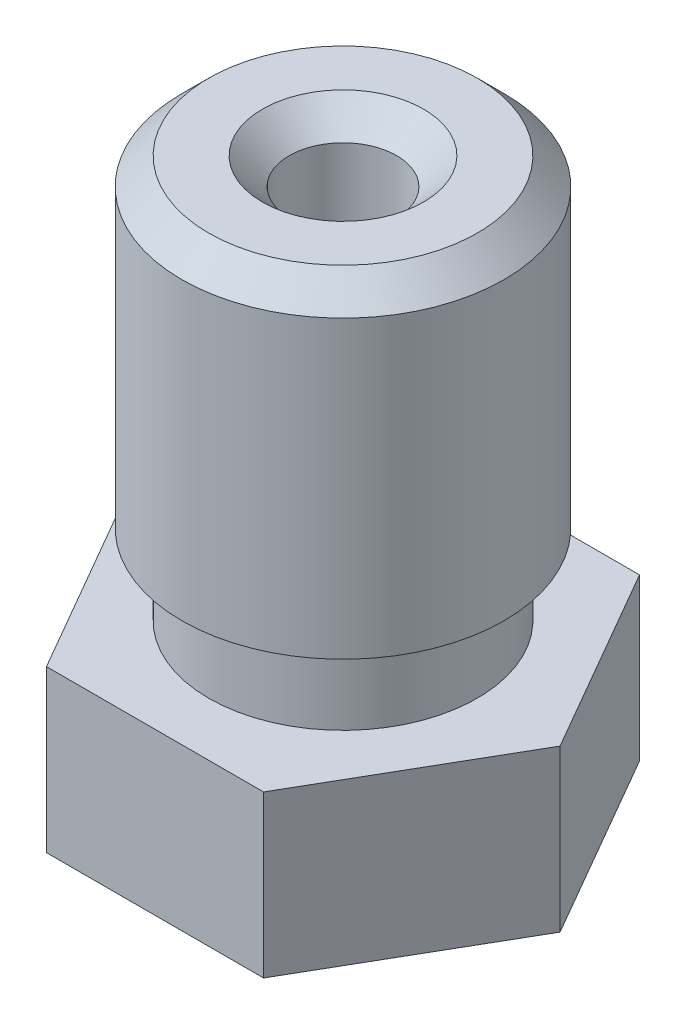
ISO-10303-21;
HEADER;
FILE_DESCRIPTION(('STEP AP214'),'2;1');
FILE_NAME('part.step','',(''),(''),'','','');
FILE_SCHEMA(('AUTOMOTIVE_DESIGN { 1 0 10303 214 1 1 1 1 }'));
ENDSEC;
DATA;
#1=APPLICATION_CONTEXT('core data for automotive mechanical design processes');
#2=APPLICATION_PROTOCOL_DEFINITION('international standard','automotive_design',2000,#1);
#3=PRODUCT_CONTEXT('',#1,'mechanical');
#4=PRODUCT('Part','Part','',(#3));
#5=PRODUCT_RELATED_PRODUCT_CATEGORY('part','',(#4));
#6=PRODUCT_DEFINITION_FORMATION('','',#4);
#7=PRODUCT_DEFINITION_CONTEXT('part definition',#1,'design');
#8=PRODUCT_DEFINITION('design','',#6,#7);
#9=PRODUCT_DEFINITION_SHAPE('','',#8);
#10=(LENGTH_UNIT() NAMED_UNIT(*) SI_UNIT(.MILLI.,.METRE.));
#11=(NAMED_UNIT(*) PLANE_ANGLE_UNIT() SI_UNIT($,.RADIAN.));
#12=(NAMED_UNIT(*) SI_UNIT($,.STERADIAN.) SOLID_ANGLE_UNIT());
#13=UNCERTAINTY_MEASURE_WITH_UNIT(LENGTH_MEASURE(1.E-05),#10,'distance_accuracy_value','');
#14=(GEOMETRIC_REPRESENTATION_CONTEXT(3) GLOBAL_UNCERTAINTY_ASSIGNED_CONTEXT((#13)) GLOBAL_UNIT_ASSIGNED_CONTEXT((#10,
#11,#12)) REPRESENTATION_CONTEXT('',''));
#15=CARTESIAN_POINT('',(0.,0.,0.));
#16=DIRECTION('',(0.,0.,1.));
#17=DIRECTION('',(1.,0.,0.));
#18=AXIS2_PLACEMENT_3D('',#15,#16,#17);
#19=CARTESIAN_POINT('',(2.02072594216369,3.,3.5));
#20=DIRECTION('',(0.,0.,1.));
#21=DIRECTION('',(1.,0.,0.));
#22=AXIS2_PLACEMENT_3D('',#19,#20,#21);
#23=PLANE('',#22);
#24=DIRECTION('',(-1.,0.,0.));
#25=VECTOR('',#24,1.);
#26=CARTESIAN_POINT('',(2.02072594216369,0.,3.5));
#27=LINE('',#26,#25);
#28=CARTESIAN_POINT('',(2.02072594216369,0.,3.5));
#29=VERTEX_POINT('',#28);
#30=CARTESIAN_POINT('',(-2.02072594216369,0.,3.5));
#31=VERTEX_POINT('',#30);
#32=EDGE_CURVE('E120',#29,#31,#27,.T.);
#33=ORIENTED_EDGE('',*,*,#32,.F.);
#34=DIRECTION('',(0.,-1.,0.));
#35=VECTOR('',#34,1.);
#36=CARTESIAN_POINT('',(2.02072594216369,3.,3.5));
#37=LINE('',#36,#35);
#38=CARTESIAN_POINT('',(2.02072594216369,3.,3.5));
#39=VERTEX_POINT('',#38);
#40=EDGE_CURVE('E49',#39,#29,#37,.T.);
#41=ORIENTED_EDGE('',*,*,#40,.F.);
#42=DIRECTION('',(-1.,0.,0.));
#43=VECTOR('',#42,1.);
#44=CARTESIAN_POINT('',(2.02072594216369,3.,3.5));
#45=LINE('',#44,#43);
#46=CARTESIAN_POINT('',(-2.02072594216369,3.,3.5));
#47=VERTEX_POINT('',#46);
#48=EDGE_CURVE('E136',#39,#47,#45,.T.);
#49=ORIENTED_EDGE('',*,*,#48,.T.);
#50=DIRECTION('',(0.,-1.,0.));
#51=VECTOR('',#50,1.);
#52=CARTESIAN_POINT('',(-2.02072594216369,3.,3.5));
#53=LINE('',#52,#51);
#54=EDGE_CURVE('E84',#47,#31,#53,.T.);
#55=ORIENTED_EDGE('',*,*,#54,.T.);
#56=EDGE_LOOP('',(#33,#41,#49,#55));
#57=FACE_BOUND('',#56,.T.);
#58=ADVANCED_FACE('F32',(#57),#23,.T.);
#59=CARTESIAN_POINT('',(4.04145188432738,3.,0.));
#60=DIRECTION('',(0.866025403784439,0.,0.5));
#61=DIRECTION('',(0.5,0.,-0.866025403784439));
#62=AXIS2_PLACEMENT_3D('',#59,#60,#61);
#63=PLANE('',#62);
#64=DIRECTION('',(-0.5,0.,0.866025403784439));
#65=VECTOR('',#64,1.);
#66=CARTESIAN_POINT('',(4.04145188432738,0.,0.));
#67=LINE('',#66,#65);
#68=CARTESIAN_POINT('',(4.04145188432738,0.,0.));
#69=VERTEX_POINT('',#68);
#70=EDGE_CURVE('E133',#69,#29,#67,.T.);
#71=ORIENTED_EDGE('',*,*,#70,.F.);
#72=DIRECTION('',(0.,-1.,0.));
#73=VECTOR('',#72,1.);
#74=CARTESIAN_POINT('',(4.04145188432738,3.,0.));
#75=LINE('',#74,#73);
#76=CARTESIAN_POINT('',(4.04145188432738,3.,0.));
#77=VERTEX_POINT('',#76);
#78=EDGE_CURVE('E72',#77,#69,#75,.T.);
#79=ORIENTED_EDGE('',*,*,#78,.F.);
#80=DIRECTION('',(-0.5,0.,0.866025403784439));
#81=VECTOR('',#80,1.);
#82=CARTESIAN_POINT('',(4.04145188432738,3.,0.));
#83=LINE('',#82,#81);
#84=EDGE_CURVE('E110',#77,#39,#83,.T.);
#85=ORIENTED_EDGE('',*,*,#84,.T.);
#86=ORIENTED_EDGE('',*,*,#40,.T.);
#87=EDGE_LOOP('',(#71,#79,#85,#86));
#88=FACE_BOUND('',#87,.T.);
#89=ADVANCED_FACE('F209',(#88),#63,.T.);
#90=CARTESIAN_POINT('',(2.02072594216369,3.,-3.5));
#91=DIRECTION('',(0.866025403784438,0.,-0.500000000000001));
#92=DIRECTION('',(-0.500000000000001,0.,-0.866025403784438));
#93=AXIS2_PLACEMENT_3D('',#90,#91,#92);
#94=PLANE('',#93);
#95=DIRECTION('',(0.500000000000001,0.,0.866025403784438));
#96=VECTOR('',#95,1.);
#97=CARTESIAN_POINT('',(2.02072594216369,0.,-3.5));
#98=LINE('',#97,#96);
#99=CARTESIAN_POINT('',(2.02072594216369,0.,-3.5));
#100=VERTEX_POINT('',#99);
#101=EDGE_CURVE('E97',#100,#69,#98,.T.);
#102=ORIENTED_EDGE('',*,*,#101,.F.);
#103=DIRECTION('',(0.,-1.,0.));
#104=VECTOR('',#103,1.);
#105=CARTESIAN_POINT('',(2.02072594216369,3.,-3.5));
#106=LINE('',#105,#104);
#107=CARTESIAN_POINT('',(2.02072594216369,3.,-3.5));
#108=VERTEX_POINT('',#107);
#109=EDGE_CURVE('E92',#108,#100,#106,.T.);
#110=ORIENTED_EDGE('',*,*,#109,.F.);
#111=DIRECTION('',(0.500000000000001,0.,0.866025403784438));
#112=VECTOR('',#111,1.);
#113=CARTESIAN_POINT('',(2.02072594216369,3.,-3.5));
#114=LINE('',#113,#112);
#115=EDGE_CURVE('E95',#108,#77,#114,.T.);
#116=ORIENTED_EDGE('',*,*,#115,.T.);
#117=ORIENTED_EDGE('',*,*,#78,.T.);
#118=EDGE_LOOP('',(#102,#110,#116,#117));
#119=FACE_BOUND('',#118,.T.);
#120=ADVANCED_FACE('F94',(#119),#94,.T.);
#121=CARTESIAN_POINT('',(-2.02072594216369,3.,-3.5));
#122=DIRECTION('',(0.,0.,-1.));
#123=DIRECTION('',(-1.,0.,0.));
#124=AXIS2_PLACEMENT_3D('',#121,#122,#123);
#125=PLANE('',#124);
#126=DIRECTION('',(1.,0.,0.));
#127=VECTOR('',#126,1.);
#128=CARTESIAN_POINT('',(-2.02072594216369,0.,-3.5));
#129=LINE('',#128,#127);
#130=CARTESIAN_POINT('',(-2.02072594216369,0.,-3.5));
#131=VERTEX_POINT('',#130);
#132=EDGE_CURVE('E130',#131,#100,#129,.T.);
#133=ORIENTED_EDGE('',*,*,#132,.F.);
#134=DIRECTION('',(0.,-1.,0.));
#135=VECTOR('',#134,1.);
#136=CARTESIAN_POINT('',(-2.02072594216369,3.,-3.5));
#137=LINE('',#136,#135);
#138=CARTESIAN_POINT('',(-2.02072594216369,3.,-3.5));
#139=VERTEX_POINT('',#138);
#140=EDGE_CURVE('E102',#139,#131,#137,.T.);
#141=ORIENTED_EDGE('',*,*,#140,.F.);
#142=DIRECTION('',(1.,0.,0.));
#143=VECTOR('',#142,1.);
#144=CARTESIAN_POINT('',(-2.02072594216369,3.,-3.5));
#145=LINE('',#144,#143);
#146=EDGE_CURVE('E108',#139,#108,#145,.T.);
#147=ORIENTED_EDGE('',*,*,#146,.T.);
#148=ORIENTED_EDGE('',*,*,#109,.T.);
#149=EDGE_LOOP('',(#133,#141,#147,#148));
#150=FACE_BOUND('',#149,.T.);
#151=ADVANCED_FACE('F112',(#150),#125,.T.);
#152=CARTESIAN_POINT('',(-4.04145188432738,3.,0.));
#153=DIRECTION('',(-0.866025403784439,0.,-0.5));
#154=DIRECTION('',(-0.5,0.,0.866025403784439));
#155=AXIS2_PLACEMENT_3D('',#152,#153,#154);
#156=PLANE('',#155);
#157=DIRECTION('',(0.5,0.,-0.866025403784439));
#158=VECTOR('',#157,1.);
#159=CARTESIAN_POINT('',(-4.04145188432738,0.,0.));
#160=LINE('',#159,#158);
#161=CARTESIAN_POINT('',(-4.04145188432738,0.,0.));
#162=VERTEX_POINT('',#161);
#163=EDGE_CURVE('E127',#162,#131,#160,.T.);
#164=ORIENTED_EDGE('',*,*,#163,.F.);
#165=DIRECTION('',(0.,-1.,0.));
#166=VECTOR('',#165,1.);
#167=CARTESIAN_POINT('',(-4.04145188432738,3.,0.));
#168=LINE('',#167,#166);
#169=CARTESIAN_POINT('',(-4.04145188432738,3.,0.));
#170=VERTEX_POINT('',#169);
#171=EDGE_CURVE('E141',#170,#162,#168,.T.);
#172=ORIENTED_EDGE('',*,*,#171,.F.);
#173=DIRECTION('',(0.5,0.,-0.866025403784439));
#174=VECTOR('',#173,1.);
#175=CARTESIAN_POINT('',(-4.04145188432738,3.,0.));
#176=LINE('',#175,#174);
#177=EDGE_CURVE('E113',#170,#139,#176,.T.);
#178=ORIENTED_EDGE('',*,*,#177,.T.);
#179=ORIENTED_EDGE('',*,*,#140,.T.);
#180=EDGE_LOOP('',(#164,#172,#178,#179));
#181=FACE_BOUND('',#180,.T.);
#182=ADVANCED_FACE('F223',(#181),#156,.T.);
#183=CARTESIAN_POINT('',(-2.02072594216369,3.,3.5));
#184=DIRECTION('',(-0.866025403784439,0.,0.5));
#185=DIRECTION('',(0.5,0.,0.866025403784439));
#186=AXIS2_PLACEMENT_3D('',#183,#184,#185);
#187=PLANE('',#186);
#188=DIRECTION('',(-0.5,0.,-0.866025403784439));
#189=VECTOR('',#188,1.);
#190=CARTESIAN_POINT('',(-2.02072594216369,0.,3.5));
#191=LINE('',#190,#189);
#192=EDGE_CURVE('E123',#31,#162,#191,.T.);
#193=ORIENTED_EDGE('',*,*,#192,.F.);
#194=ORIENTED_EDGE('',*,*,#54,.F.);
#195=DIRECTION('',(-0.5,0.,-0.866025403784439));
#196=VECTOR('',#195,1.);
#197=CARTESIAN_POINT('',(-2.02072594216369,3.,3.5));
#198=LINE('',#197,#196);
#199=EDGE_CURVE('E115',#47,#170,#198,.T.);
#200=ORIENTED_EDGE('',*,*,#199,.T.);
#201=ORIENTED_EDGE('',*,*,#171,.T.);
#202=EDGE_LOOP('',(#193,#194,#200,#201));
#203=FACE_BOUND('',#202,.T.);
#204=ADVANCED_FACE('F205',(#203),#187,.T.);
#205=CARTESIAN_POINT('',(0.,3.,0.));
#206=DIRECTION('',(0.,-1.,0.));
#207=DIRECTION('',(0.,0.,-1.));
#208=AXIS2_PLACEMENT_3D('',#205,#206,#207);
#209=PLANE('',#208);
#210=CARTESIAN_POINT('',(0.,3.,0.));
#211=DIRECTION('',(0.,1.,0.));
#212=DIRECTION('',(0.,0.,1.));
#213=AXIS2_PLACEMENT_3D('',#210,#211,#212);
#214=CIRCLE('',#213,2.5);
#215=CARTESIAN_POINT('',(0.,3.,2.5));
#216=VERTEX_POINT('',#215);
#217=EDGE_CURVE('E124',#216,#216,#214,.T.);
#218=ORIENTED_EDGE('',*,*,#217,.F.);
#219=EDGE_LOOP('',(#218));
#220=FACE_BOUND('',#219,.T.);
#221=ORIENTED_EDGE('',*,*,#48,.F.);
#222=ORIENTED_EDGE('',*,*,#84,.F.);
#223=ORIENTED_EDGE('',*,*,#115,.F.);
#224=ORIENTED_EDGE('',*,*,#146,.F.);
#225=ORIENTED_EDGE('',*,*,#177,.F.);
#226=ORIENTED_EDGE('',*,*,#199,.F.);
#227=EDGE_LOOP('',(#221,#222,#223,#224,#225,#226));
#228=FACE_BOUND('',#227,.T.);
#229=ADVANCED_FACE('F106',(#220,#228),#209,.F.);
#230=CARTESIAN_POINT('',(0.,0.,0.));
#231=DIRECTION('',(0.,-1.,0.));
#232=DIRECTION('',(0.,0.,-1.));
#233=AXIS2_PLACEMENT_3D('',#230,#231,#232);
#234=PLANE('',#233);
#235=CARTESIAN_POINT('',(0.,0.,0.));
#236=DIRECTION('',(0.,-1.,0.));
#237=DIRECTION('',(0.,0.,-1.));
#238=AXIS2_PLACEMENT_3D('',#235,#236,#237);
#239=CIRCLE('',#238,2.50000000004502);
#240=CARTESIAN_POINT('',(-2.50000000004502,0.,0.));
#241=VERTEX_POINT('',#240);
#242=EDGE_CURVE('E138',#241,#241,#239,.T.);
#243=ORIENTED_EDGE('',*,*,#242,.F.);
#244=EDGE_LOOP('',(#243));
#245=FACE_BOUND('',#244,.T.);
#246=ORIENTED_EDGE('',*,*,#32,.T.);
#247=ORIENTED_EDGE('',*,*,#192,.T.);
#248=ORIENTED_EDGE('',*,*,#163,.T.);
#249=ORIENTED_EDGE('',*,*,#132,.T.);
#250=ORIENTED_EDGE('',*,*,#101,.T.);
#251=ORIENTED_EDGE('',*,*,#70,.T.);
#252=EDGE_LOOP('',(#246,#247,#248,#249,#250,#251));
#253=FACE_BOUND('',#252,.T.);
#254=ADVANCED_FACE('F208',(#245,#253),#234,.T.);
#255=CARTESIAN_POINT('',(0.,3.,0.));
#256=DIRECTION('',(0.,1.,0.));
#257=DIRECTION('',(0.,0.,1.));
#258=AXIS2_PLACEMENT_3D('',#255,#256,#257);
#259=CYLINDRICAL_SURFACE('',#258,2.5);
#260=ORIENTED_EDGE('',*,*,#217,.T.);
#261=EDGE_LOOP('',(#260));
#262=FACE_BOUND('',#261,.T.);
#263=CARTESIAN_POINT('',(0.,4.5,0.));
#264=DIRECTION('',(0.,1.,0.));
#265=DIRECTION('',(0.,0.,1.));
#266=AXIS2_PLACEMENT_3D('',#263,#264,#265);
#267=CIRCLE('',#266,2.5);
#268=CARTESIAN_POINT('',(0.,4.5,2.5));
#269=VERTEX_POINT('',#268);
#270=EDGE_CURVE('E197',#269,#269,#267,.T.);
#271=ORIENTED_EDGE('',*,*,#270,.F.);
#272=EDGE_LOOP('',(#271));
#273=FACE_BOUND('',#272,.T.);
#274=ADVANCED_FACE('F166',(#262,#273),#259,.T.);
#275=CARTESIAN_POINT('',(0.,10.5,0.));
#276=DIRECTION('',(0.,1.,0.));
#277=DIRECTION('',(0.,0.,1.));
#278=AXIS2_PLACEMENT_3D('',#275,#276,#277);
#279=PLANE('',#278);
#280=CARTESIAN_POINT('',(0.,10.5,0.));
#281=DIRECTION('',(0.,1.,0.));
#282=DIRECTION('',(0.,0.,1.));
#283=AXIS2_PLACEMENT_3D('',#280,#281,#282);
#284=CIRCLE('',#283,2.4999999999834);
#285=CARTESIAN_POINT('',(0.,10.5,2.4999999999834));
#286=VERTEX_POINT('',#285);
#287=EDGE_CURVE('E149',#286,#286,#284,.T.);
#288=ORIENTED_EDGE('',*,*,#287,.T.);
#289=EDGE_LOOP('',(#288));
#290=FACE_BOUND('',#289,.T.);
#291=CARTESIAN_POINT('',(-1.10963134903613E-11,10.5,0.));
#292=DIRECTION('',(0.,1.,0.));
#293=DIRECTION('',(0.,0.,1.));
#294=AXIS2_PLACEMENT_3D('',#291,#292,#293);
#295=CIRCLE('',#294,1.5000000000277);
#296=CARTESIAN_POINT('',(-1.10963134903613E-11,10.5,1.5000000000277));
#297=VERTEX_POINT('',#296);
#298=EDGE_CURVE('E146',#297,#297,#295,.F.);
#299=ORIENTED_EDGE('',*,*,#298,.T.);
#300=EDGE_LOOP('',(#299));
#301=FACE_BOUND('',#300,.T.);
#302=ADVANCED_FACE('F163',(#290,#301),#279,.T.);
#303=CARTESIAN_POINT('',(0.,3.,0.));
#304=DIRECTION('',(0.,1.,0.));
#305=DIRECTION('',(0.,0.,1.));
#306=AXIS2_PLACEMENT_3D('',#303,#304,#305);
#307=CYLINDRICAL_SURFACE('',#306,3.);
#308=CARTESIAN_POINT('',(0.,9.9999999999834,0.));
#309=DIRECTION('',(0.,1.,0.));
#310=DIRECTION('',(0.,0.,1.));
#311=AXIS2_PLACEMENT_3D('',#308,#309,#310);
#312=CIRCLE('',#311,3.);
#313=CARTESIAN_POINT('',(0.,9.9999999999834,3.));
#314=VERTEX_POINT('',#313);
#315=EDGE_CURVE('E41',#314,#314,#312,.F.);
#316=ORIENTED_EDGE('',*,*,#315,.T.);
#317=EDGE_LOOP('',(#316));
#318=FACE_BOUND('',#317,.T.);
#319=CARTESIAN_POINT('',(0.,4.5,0.));
#320=DIRECTION('',(0.,1.,0.));
#321=DIRECTION('',(0.,0.,1.));
#322=AXIS2_PLACEMENT_3D('',#319,#320,#321);
#323=CIRCLE('',#322,3.);
#324=CARTESIAN_POINT('',(0.,4.5,3.));
#325=VERTEX_POINT('',#324);
#326=EDGE_CURVE('E200',#325,#325,#323,.T.);
#327=ORIENTED_EDGE('',*,*,#326,.T.);
#328=EDGE_LOOP('',(#327));
#329=FACE_BOUND('',#328,.T.);
#330=ADVANCED_FACE('F154',(#318,#329),#307,.T.);
#331=CARTESIAN_POINT('',(3.,4.5,0.));
#332=DIRECTION('',(0.,-1.,0.));
#333=DIRECTION('',(0.,0.,-1.));
#334=AXIS2_PLACEMENT_3D('',#331,#332,#333);
#335=PLANE('',#334);
#336=ORIENTED_EDGE('',*,*,#270,.T.);
#337=EDGE_LOOP('',(#336));
#338=FACE_BOUND('',#337,.T.);
#339=ORIENTED_EDGE('',*,*,#326,.F.);
#340=EDGE_LOOP('',(#339));
#341=FACE_BOUND('',#340,.T.);
#342=ADVANCED_FACE('F243',(#338,#341),#335,.T.);
#343=CARTESIAN_POINT('',(0.,-2.,0.));
#344=DIRECTION('',(0.,1.,0.));
#345=DIRECTION('',(-1.,0.,0.));
#346=AXIS2_PLACEMENT_3D('',#343,#344,#345);
#347=CONICAL_SURFACE('',#346,0.50000000004502,0.785398163397449);
#348=CARTESIAN_POINT('',(0.,-2.,0.));
#349=DIRECTION('',(0.,-1.,0.));
#350=DIRECTION('',(1.,0.,0.));
#351=AXIS2_PLACEMENT_3D('',#348,#349,#350);
#352=CIRCLE('',#351,0.50000000004502);
#353=CARTESIAN_POINT('',(-0.50000000004502,-2.,0.));
#354=VERTEX_POINT('',#353);
#355=EDGE_CURVE('E188',#354,#354,#352,.T.);
#356=CARTESIAN_POINT('',(-2.50000000004502,0.,0.));
#357=CARTESIAN_POINT('',(-2.47916666671169,-0.0208333333333329,0.));
#358=CARTESIAN_POINT('',(-2.45833333337836,-0.0416666666666663,0.));
#359=CARTESIAN_POINT('',(-2.41666666671169,-0.083333333333333,0.));
#360=CARTESIAN_POINT('',(-2.39583333337836,-0.104166666666666,0.));
#361=CARTESIAN_POINT('',(-2.35416666671169,-0.145833333333333,0.));
#362=CARTESIAN_POINT('',(-2.33333333337836,-0.166666666666666,0.));
#363=CARTESIAN_POINT('',(-2.29166666671169,-0.208333333333333,0.));
#364=CARTESIAN_POINT('',(-2.27083333337836,-0.229166666666666,0.));
#365=CARTESIAN_POINT('',(-2.22916666671169,-0.270833333333333,0.));
#366=CARTESIAN_POINT('',(-2.20833333337836,-0.291666666666666,0.));
#367=CARTESIAN_POINT('',(-2.16666666671169,-0.333333333333333,0.));
#368=CARTESIAN_POINT('',(-2.14583333337836,-0.354166666666667,0.));
#369=CARTESIAN_POINT('',(-2.10416666671169,-0.395833333333333,0.));
#370=CARTESIAN_POINT('',(-2.08333333337836,-0.416666666666667,0.));
#371=CARTESIAN_POINT('',(-2.04166666671169,-0.458333333333334,0.));
#372=CARTESIAN_POINT('',(-2.02083333337836,-0.479166666666667,0.));
#373=CARTESIAN_POINT('',(-1.97916666671169,-0.520833333333334,0.));
#374=CARTESIAN_POINT('',(-1.95833333337836,-0.541666666666667,0.));
#375=CARTESIAN_POINT('',(-1.91666666671169,-0.583333333333334,0.));
#376=CARTESIAN_POINT('',(-1.89583333337836,-0.604166666666667,0.));
#377=CARTESIAN_POINT('',(-1.85416666671169,-0.645833333333334,0.));
#378=CARTESIAN_POINT('',(-1.83333333337836,-0.666666666666667,0.));
#379=CARTESIAN_POINT('',(-1.79166666671169,-0.708333333333334,0.));
#380=CARTESIAN_POINT('',(-1.77083333337836,-0.729166666666667,0.));
#381=CARTESIAN_POINT('',(-1.72916666671169,-0.770833333333334,0.));
#382=CARTESIAN_POINT('',(-1.70833333337836,-0.791666666666667,0.));
#383=CARTESIAN_POINT('',(-1.66666666671169,-0.833333333333334,0.));
#384=CARTESIAN_POINT('',(-1.64583333337836,-0.854166666666667,0.));
#385=CARTESIAN_POINT('',(-1.60416666671169,-0.895833333333334,0.));
#386=CARTESIAN_POINT('',(-1.58333333337836,-0.916666666666668,0.));
#387=CARTESIAN_POINT('',(-1.54166666671169,-0.958333333333334,0.));
#388=CARTESIAN_POINT('',(-1.52083333337836,-0.979166666666668,0.));
#389=CARTESIAN_POINT('',(-1.47916666671169,-1.02083333333333,0.));
#390=CARTESIAN_POINT('',(-1.45833333337836,-1.04166666666667,0.));
#391=CARTESIAN_POINT('',(-1.41666666671169,-1.08333333333333,0.));
#392=CARTESIAN_POINT('',(-1.39583333337836,-1.10416666666667,0.));
#393=CARTESIAN_POINT('',(-1.35416666671169,-1.14583333333333,0.));
#394=CARTESIAN_POINT('',(-1.33333333337836,-1.16666666666667,0.));
#395=CARTESIAN_POINT('',(-1.29166666671169,-1.20833333333333,0.));
#396=CARTESIAN_POINT('',(-1.27083333337836,-1.22916666666667,0.));
#397=CARTESIAN_POINT('',(-1.22916666671169,-1.27083333333333,0.));
#398=CARTESIAN_POINT('',(-1.20833333337835,-1.29166666666667,0.));
#399=CARTESIAN_POINT('',(-1.16666666671169,-1.33333333333333,0.));
#400=CARTESIAN_POINT('',(-1.14583333337835,-1.35416666666667,0.));
#401=CARTESIAN_POINT('',(-1.10416666671169,-1.39583333333333,0.));
#402=CARTESIAN_POINT('',(-1.08333333337835,-1.41666666666667,0.));
#403=CARTESIAN_POINT('',(-1.04166666671169,-1.45833333333333,0.));
#404=CARTESIAN_POINT('',(-1.02083333337835,-1.47916666666667,0.));
#405=CARTESIAN_POINT('',(-0.979166666711688,-1.52083333333333,0.));
#406=CARTESIAN_POINT('',(-0.958333333378354,-1.54166666666667,0.));
#407=CARTESIAN_POINT('',(-0.916666666711687,-1.58333333333333,0.));
#408=CARTESIAN_POINT('',(-0.895833333378354,-1.60416666666667,0.));
#409=CARTESIAN_POINT('',(-0.854166666711687,-1.64583333333333,0.));
#410=CARTESIAN_POINT('',(-0.833333333378354,-1.66666666666667,0.));
#411=CARTESIAN_POINT('',(-0.791666666711687,-1.70833333333333,0.));
#412=CARTESIAN_POINT('',(-0.770833333378354,-1.72916666666667,0.));
#413=CARTESIAN_POINT('',(-0.729166666711687,-1.77083333333334,0.));
#414=CARTESIAN_POINT('',(-0.708333333378354,-1.79166666666667,0.));
#415=CARTESIAN_POINT('',(-0.666666666711687,-1.83333333333334,0.));
#416=CARTESIAN_POINT('',(-0.645833333378353,-1.85416666666667,0.));
#417=CARTESIAN_POINT('',(-0.604166666711687,-1.89583333333334,0.));
#418=CARTESIAN_POINT('',(-0.583333333378353,-1.91666666666667,0.));
#419=CARTESIAN_POINT('',(-0.541666666711687,-1.95833333333334,0.));
#420=CARTESIAN_POINT('',(-0.520833333378353,-1.97916666666667,0.));
#421=CARTESIAN_POINT('',(-0.50000000004502,-2.,0.));
#422=B_SPLINE_CURVE_WITH_KNOTS('',3,(#356,#357,#358,#359,#360,#361,#362,#363,#364,#365,#366,
#367,#368,#369,#370,#371,#372,#373,#374,#375,#376,#377,#378,#379,#380,#381,#382,#383,#384,#385,
#386,#387,#388,#389,#390,#391,#392,#393,#394,#395,#396,#397,#398,#399,#400,#401,#402,#403,#404,
#405,#406,#407,#408,#409,#410,#411,#412,#413,#414,#415,#416,#417,#418,#419,#420,#421),
.UNSPECIFIED.,.F.,.F.,(4,2,2,2,2,2,2,2,2,2,2,2,2,2,2,2,2,2,2,2,2,2,2,2,2,2,2,2,2,2,2,2,4),(0.,
0.0883883476483185,0.176776695296637,0.265165042944956,0.353553390593274,0.441941738241593,
0.530330085889912,0.61871843353823,0.707106781186549,0.795495128834867,0.883883476483186,
0.972271824131505,1.06066017177982,1.14904851942814,1.23743686707646,1.32582521472478,
1.4142135623731,1.50260191002142,1.59099025766973,1.67937860531805,1.76776695296637,
1.85615530061469,1.94454364826301,2.03293199591133,2.12132034355965,2.20970869120797,
2.29809703885628,2.3864853865046,2.47487373415292,2.56326208180124,2.65165042944956,
2.74003877709788,2.8284271247462),.UNSPECIFIED.);
#423=EDGE_CURVE('BSEAM246',#241,#354,#422,.T.);
#424=ORIENTED_EDGE('',*,*,#242,.T.);
#425=ORIENTED_EDGE('',*,*,#355,.F.);
#426=ORIENTED_EDGE('',*,*,#423,.T.);
#427=ORIENTED_EDGE('',*,*,#423,.F.);
#428=EDGE_LOOP('',(#424,#426,#425,#427));
#429=FACE_BOUND('',#428,.T.);
#430=ADVANCED_FACE('F246',(#429),#347,.T.);
#431=CARTESIAN_POINT('',(0.,-2.,0.));
#432=DIRECTION('',(0.,-1.,0.));
#433=DIRECTION('',(1.,0.,0.));
#434=AXIS2_PLACEMENT_3D('',#431,#432,#433);
#435=PLANE('',#434);
#436=CARTESIAN_POINT('',(-1.10963134903613E-11,-2.,0.));
#437=DIRECTION('',(0.,1.,0.));
#438=DIRECTION('',(0.,0.,1.));
#439=AXIS2_PLACEMENT_3D('',#436,#437,#438);
#440=CIRCLE('',#439,0.2);
#441=CARTESIAN_POINT('',(-1.10963134903613E-11,-2.,0.2));
#442=VERTEX_POINT('',#441);
#443=EDGE_CURVE('E184',#442,#442,#440,.T.);
#444=ORIENTED_EDGE('',*,*,#443,.T.);
#445=EDGE_LOOP('',(#444));
#446=FACE_BOUND('',#445,.T.);
#447=ORIENTED_EDGE('',*,*,#355,.T.);
#448=EDGE_LOOP('',(#447));
#449=FACE_BOUND('',#448,.T.);
#450=ADVANCED_FACE('F250',(#446,#449),#435,.T.);
#451=CARTESIAN_POINT('',(-1.10963134903613E-11,-2.,0.));
#452=DIRECTION('',(0.,1.,0.));
#453=DIRECTION('',(0.,0.,1.));
#454=AXIS2_PLACEMENT_3D('',#451,#452,#453);
#455=CYLINDRICAL_SURFACE('',#454,0.2);
#456=ORIENTED_EDGE('',*,*,#443,.F.);
#457=EDGE_LOOP('',(#456));
#458=FACE_BOUND('',#457,.T.);
#459=CARTESIAN_POINT('',(-1.10963134903613E-11,-1.20000000003984,0.));
#460=DIRECTION('',(0.,1.,0.));
#461=DIRECTION('',(0.,0.,1.));
#462=AXIS2_PLACEMENT_3D('',#459,#460,#461);
#463=CIRCLE('',#462,0.2);
#464=CARTESIAN_POINT('',(-1.10963134903613E-11,-1.20000000003984,0.2));
#465=VERTEX_POINT('',#464);
#466=EDGE_CURVE('E272',#465,#465,#463,.T.);
#467=ORIENTED_EDGE('',*,*,#466,.T.);
#468=EDGE_LOOP('',(#467));
#469=FACE_BOUND('',#468,.T.);
#470=ADVANCED_FACE('F178',(#458,#469),#455,.F.);
#471=CARTESIAN_POINT('',(-1.10963134903613E-11,-2.,0.));
#472=DIRECTION('',(0.,1.,0.));
#473=DIRECTION('',(0.,0.,1.));
#474=AXIS2_PLACEMENT_3D('',#471,#472,#473);
#475=CYLINDRICAL_SURFACE('',#474,1.0000000000111);
#476=CARTESIAN_POINT('',(-1.10963134903613E-11,9.9999999999834,0.));
#477=DIRECTION('',(0.,1.,0.));
#478=DIRECTION('',(0.,0.,1.));
#479=AXIS2_PLACEMENT_3D('',#476,#477,#478);
#480=CIRCLE('',#479,1.0000000000111);
#481=CARTESIAN_POINT('',(-1.10963134903613E-11,9.9999999999834,1.0000000000111));
#482=VERTEX_POINT('',#481);
#483=EDGE_CURVE('E11',#482,#482,#480,.T.);
#484=ORIENTED_EDGE('',*,*,#483,.T.);
#485=EDGE_LOOP('',(#484));
#486=FACE_BOUND('',#485,.T.);
#487=CARTESIAN_POINT('',(-1.10963134903613E-11,0.,0.));
#488=DIRECTION('',(0.,1.,0.));
#489=DIRECTION('',(0.,0.,1.));
#490=AXIS2_PLACEMENT_3D('',#487,#488,#489);
#491=CIRCLE('',#490,1.0000000000111);
#492=CARTESIAN_POINT('',(-1.10963134903613E-11,0.,1.0000000000111));
#493=VERTEX_POINT('',#492);
#494=EDGE_CURVE('E182',#493,#493,#491,.T.);
#495=ORIENTED_EDGE('',*,*,#494,.F.);
#496=EDGE_LOOP('',(#495));
#497=FACE_BOUND('',#496,.T.);
#498=ADVANCED_FACE('F174',(#486,#497),#475,.F.);
#499=CARTESIAN_POINT('',(-1.10963134903613E-11,0.,0.));
#500=DIRECTION('',(0.,1.,0.));
#501=DIRECTION('',(0.,0.,1.));
#502=AXIS2_PLACEMENT_3D('',#499,#500,#501);
#503=CONICAL_SURFACE('',#502,1.0000000000111,0.832981266710198);
#504=CARTESIAN_POINT('',(-1.10963134903613E-11,-0.227272727272521,0.));
#505=DIRECTION('',(0.,1.,0.));
#506=DIRECTION('',(0.,0.,1.));
#507=AXIS2_PLACEMENT_3D('',#504,#505,#506);
#508=CIRCLE('',#507,0.749999999993361);
#509=CARTESIAN_POINT('',(-1.10963134903613E-11,-0.227272727272521,0.749999999993361));
#510=VERTEX_POINT('',#509);
#511=EDGE_CURVE('E185',#510,#510,#508,.T.);
#512=ORIENTED_EDGE('',*,*,#511,.F.);
#513=EDGE_LOOP('',(#512));
#514=FACE_BOUND('',#513,.T.);
#515=ORIENTED_EDGE('',*,*,#494,.T.);
#516=EDGE_LOOP('',(#515));
#517=FACE_BOUND('',#516,.T.);
#518=ADVANCED_FACE('F177',(#514,#517),#503,.F.);
#519=CARTESIAN_POINT('',(-1.10963134903613E-11,-2.,0.));
#520=DIRECTION('',(0.,1.,0.));
#521=DIRECTION('',(0.,0.,1.));
#522=AXIS2_PLACEMENT_3D('',#519,#520,#521);
#523=CYLINDRICAL_SURFACE('',#522,0.749999999993361);
#524=CARTESIAN_POINT('',(-1.10963134903613E-11,-0.700000000000002,0.));
#525=DIRECTION('',(0.,1.,0.));
#526=DIRECTION('',(0.,0.,1.));
#527=AXIS2_PLACEMENT_3D('',#524,#525,#526);
#528=CIRCLE('',#527,0.749999999993361);
#529=CARTESIAN_POINT('',(-1.10963134903613E-11,-0.700000000000002,0.749999999993361));
#530=VERTEX_POINT('',#529);
#531=EDGE_CURVE('E191',#530,#530,#528,.T.);
#532=ORIENTED_EDGE('',*,*,#531,.F.);
#533=EDGE_LOOP('',(#532));
#534=FACE_BOUND('',#533,.T.);
#535=ORIENTED_EDGE('',*,*,#511,.T.);
#536=EDGE_LOOP('',(#535));
#537=FACE_BOUND('',#536,.T.);
#538=ADVANCED_FACE('F260',(#534,#537),#523,.F.);
#539=CARTESIAN_POINT('',(-1.10963134903613E-11,-0.700000000000002,0.));
#540=DIRECTION('',(0.,1.,0.));
#541=DIRECTION('',(0.,0.,1.));
#542=AXIS2_PLACEMENT_3D('',#539,#540,#541);
#543=CONICAL_SURFACE('',#542,0.749999999993361,0.832981266628769);
#544=CARTESIAN_POINT('',(-1.10963134903613E-11,-1.20000000003984,0.2));
#545=CARTESIAN_POINT('',(-1.10963134903613E-11,-1.19479166670609,0.205729166666598));
#546=CARTESIAN_POINT('',(-1.10963134903613E-11,-1.18958333337234,0.211458333333195));
#547=CARTESIAN_POINT('',(-1.10963134903613E-11,-1.17916666670484,0.22291666666639));
#548=CARTESIAN_POINT('',(-1.10963134903613E-11,-1.17395833337109,0.228645833332988));
#549=CARTESIAN_POINT('',(-1.10963134903613E-11,-1.1635416667036,0.240104166666183));
#550=CARTESIAN_POINT('',(-1.10963134903613E-11,-1.15833333336985,0.24583333333278));
#551=CARTESIAN_POINT('',(-1.10963134903613E-11,-1.14791666670235,0.257291666665975));
#552=CARTESIAN_POINT('',(-1.10963134903613E-11,-1.14270833336861,0.263020833332573));
#553=CARTESIAN_POINT('',(-1.10963134903613E-11,-1.13229166670111,0.274479166665768));
#554=CARTESIAN_POINT('',(-1.10963134903613E-11,-1.12708333336736,0.280208333332365));
#555=CARTESIAN_POINT('',(-1.10963134903613E-11,-1.11666666669986,0.29166666666556));
#556=CARTESIAN_POINT('',(-1.10963134903613E-11,-1.11145833336612,0.297395833332158));
#557=CARTESIAN_POINT('',(-1.10963134903613E-11,-1.10104166669862,0.308854166665353));
#558=CARTESIAN_POINT('',(-1.10963134903613E-11,-1.09583333336487,0.31458333333195));
#559=CARTESIAN_POINT('',(-1.10963134903613E-11,-1.08541666669737,0.326041666665145));
#560=CARTESIAN_POINT('',(-1.10963134903613E-11,-1.08020833336363,0.331770833331743));
#561=CARTESIAN_POINT('',(-1.10963134903613E-11,-1.06979166669613,0.343229166664938));
#562=CARTESIAN_POINT('',(-1.10963134903613E-11,-1.06458333336238,0.348958333331535));
#563=CARTESIAN_POINT('',(-1.10963134903613E-11,-1.05416666669488,0.36041666666473));
#564=CARTESIAN_POINT('',(-1.10963134903613E-11,-1.04895833336114,0.366145833331328));
#565=CARTESIAN_POINT('',(-1.10963134903613E-11,-1.03854166669364,0.377604166664523));
#566=CARTESIAN_POINT('',(-1.10963134903613E-11,-1.03333333335989,0.38333333333112));
#567=CARTESIAN_POINT('',(-1.10963134903613E-11,-1.02291666669239,0.394791666664315));
#568=CARTESIAN_POINT('',(-1.10963134903613E-11,-1.01770833335865,0.400520833330913));
#569=CARTESIAN_POINT('',(-1.10963134903613E-11,-1.00729166669115,0.411979166664108));
#570=CARTESIAN_POINT('',(-1.10963134903613E-11,-1.0020833333574,0.417708333330705));
#571=CARTESIAN_POINT('',(-1.10963134903613E-11,-0.991666666689905,0.429166666663901));
#572=CARTESIAN_POINT('',(-1.10963134903613E-11,-0.986458333356157,0.434895833330498));
#573=CARTESIAN_POINT('',(-1.10963134903613E-11,-0.97604166668866,0.446354166663693));
#574=CARTESIAN_POINT('',(-1.10963134903613E-11,-0.970833333354912,0.45208333333029));
#575=CARTESIAN_POINT('',(-1.10963134903613E-11,-0.960416666687416,0.463541666663485));
#576=CARTESIAN_POINT('',(-1.10963134903613E-11,-0.955208333353667,0.469270833330083));
#577=CARTESIAN_POINT('',(-1.10963134903613E-11,-0.944791666686171,0.480729166663278));
#578=CARTESIAN_POINT('',(-1.10963134903613E-11,-0.939583333352423,0.486458333329876));
#579=CARTESIAN_POINT('',(-1.10963134903613E-11,-0.929166666684926,0.497916666663071));
#580=CARTESIAN_POINT('',(-1.10963134903613E-11,-0.923958333351178,0.503645833329668));
#581=CARTESIAN_POINT('',(-1.10963134903613E-11,-0.913541666683681,0.515104166662863));
#582=CARTESIAN_POINT('',(-1.10963134903613E-11,-0.908333333349933,0.520833333329461));
#583=CARTESIAN_POINT('',(-1.10963134903613E-11,-0.897916666682436,0.532291666662656));
#584=CARTESIAN_POINT('',(-1.10963134903613E-11,-0.892708333348688,0.538020833329253));
#585=CARTESIAN_POINT('',(-1.10963134903613E-11,-0.882291666681191,0.549479166662448));
#586=CARTESIAN_POINT('',(-1.10963134903613E-11,-0.877083333347443,0.555208333329046));
#587=CARTESIAN_POINT('',(-1.10963134903613E-11,-0.866666666679947,0.566666666662241));
#588=CARTESIAN_POINT('',(-1.10963134903613E-11,-0.861458333346198,0.572395833328838));
#589=CARTESIAN_POINT('',(-1.10963134903613E-11,-0.851041666678702,0.583854166662033));
#590=CARTESIAN_POINT('',(-1.10963134903613E-11,-0.845833333344954,0.589583333328631));
#591=CARTESIAN_POINT('',(-1.10963134903613E-11,-0.835416666677457,0.601041666661826));
#592=CARTESIAN_POINT('',(-1.10963134903613E-11,-0.830208333343709,0.606770833328423));
#593=CARTESIAN_POINT('',(-1.10963134903613E-11,-0.819791666676212,0.618229166661618));
#594=CARTESIAN_POINT('',(-1.10963134903613E-11,-0.814583333342464,0.623958333328216));
#595=CARTESIAN_POINT('',(-1.10963134903613E-11,-0.804166666674967,0.635416666661411));
#596=CARTESIAN_POINT('',(-1.10963134903613E-11,-0.798958333341219,0.641145833328008));
#597=CARTESIAN_POINT('',(-1.10963134903613E-11,-0.788541666673722,0.652604166661203));
#598=CARTESIAN_POINT('',(-1.10963134903613E-11,-0.783333333339974,0.658333333327801));
#599=CARTESIAN_POINT('',(-1.10963134903613E-11,-0.772916666672478,0.669791666660996));
#600=CARTESIAN_POINT('',(-1.10963134903613E-11,-0.76770833333873,0.675520833327593));
#601=CARTESIAN_POINT('',(-1.10963134903613E-11,-0.757291666671233,0.686979166660788));
#602=CARTESIAN_POINT('',(-1.10963134903613E-11,-0.752083333337485,0.692708333327386));
#603=CARTESIAN_POINT('',(-1.10963134903613E-11,-0.741666666669988,0.704166666660581));
#604=CARTESIAN_POINT('',(-1.10963134903613E-11,-0.73645833333624,0.709895833327178));
#605=CARTESIAN_POINT('',(-1.10963134903613E-11,-0.726041666668743,0.721354166660373));
#606=CARTESIAN_POINT('',(-1.10963134903613E-11,-0.720833333334995,0.727083333326971));
#607=CARTESIAN_POINT('',(-1.10963134903613E-11,-0.710416666667498,0.738541666660166));
#608=CARTESIAN_POINT('',(-1.10963134903613E-11,-0.70520833333375,0.744270833326763));
#609=CARTESIAN_POINT('',(-1.10963134903613E-11,-0.700000000000002,0.749999999993361));
#610=B_SPLINE_CURVE_WITH_KNOTS('',3,(#544,#545,#546,#547,#548,#549,#550,#551,#552,#553,#554,
#555,#556,#557,#558,#559,#560,#561,#562,#563,#564,#565,#566,#567,#568,#569,#570,#571,#572,#573,
#574,#575,#576,#577,#578,#579,#580,#581,#582,#583,#584,#585,#586,#587,#588,#589,#590,#591,#592,
#593,#594,#595,#596,#597,#598,#599,#600,#601,#602,#603,#604,#605,#606,#607,#608,#609),
.UNSPECIFIED.,.F.,.F.,(4,2,2,2,2,2,2,2,2,2,2,2,2,2,2,2,2,2,2,2,2,2,2,2,2,2,2,2,2,2,2,2,4),(0.,
0.0232282324183691,0.0464564648367379,0.069684697255107,0.092912929673476,0.116141162091845,
0.139369394510214,0.162597626928583,0.185825859346952,0.209054091765321,0.23228232418369,
0.255510556602059,0.278738789020428,0.301967021438797,0.325195253857166,0.348423486275535,
0.371651718693904,0.394879951112273,0.418108183530642,0.441336415949011,0.46456464836738,
0.487792880785749,0.511021113204118,0.534249345622487,0.557477578040856,0.580705810459225,
0.603934042877594,0.627162275295963,0.650390507714332,0.673618740132701,0.69684697255107,
0.720075204969439,0.743303437387808),.UNSPECIFIED.);
#611=EDGE_CURVE('BSEAM160',#465,#530,#610,.T.);
#612=ORIENTED_EDGE('',*,*,#466,.F.);
#613=ORIENTED_EDGE('',*,*,#531,.T.);
#614=ORIENTED_EDGE('',*,*,#611,.T.);
#615=ORIENTED_EDGE('',*,*,#611,.F.);
#616=EDGE_LOOP('',(#612,#614,#613,#615));
#617=FACE_BOUND('',#616,.T.);
#618=ADVANCED_FACE('F160',(#617),#543,.F.);
#619=CARTESIAN_POINT('',(0.,10.5,0.));
#620=DIRECTION('',(0.,-1.,0.));
#621=DIRECTION('',(0.,0.,-1.));
#622=AXIS2_PLACEMENT_3D('',#619,#620,#621);
#623=CONICAL_SURFACE('',#622,2.4999999999834,0.785398163397446);
#624=ORIENTED_EDGE('',*,*,#315,.F.);
#625=EDGE_LOOP('',(#624));
#626=FACE_BOUND('',#625,.T.);
#627=ORIENTED_EDGE('',*,*,#287,.F.);
#628=EDGE_LOOP('',(#627));
#629=FACE_BOUND('',#628,.T.);
#630=ADVANCED_FACE('F157',(#626,#629),#623,.T.);
#631=CARTESIAN_POINT('',(-1.10963134903613E-11,9.9999999999834,0.));
#632=DIRECTION('',(0.,1.,0.));
#633=DIRECTION('',(0.,0.,1.));
#634=AXIS2_PLACEMENT_3D('',#631,#632,#633);
#635=CONICAL_SURFACE('',#634,1.0000000000111,0.785398163397452);
#636=ORIENTED_EDGE('',*,*,#298,.F.);
#637=EDGE_LOOP('',(#636));
#638=FACE_BOUND('',#637,.T.);
#639=ORIENTED_EDGE('',*,*,#483,.F.);
#640=EDGE_LOOP('',(#639));
#641=FACE_BOUND('',#640,.T.);
#642=ADVANCED_FACE('F34',(#638,#641),#635,.F.);
#643=CLOSED_SHELL('',(#58,#89,#120,#151,#182,#204,#229,#254,#274,#302,#330,#342,#430,#450,#470,
#498,#518,#538,#618,#630,#642));
#644=MANIFOLD_SOLID_BREP('B2',#643);
#645=ADVANCED_BREP_SHAPE_REPRESENTATION('',(#18,#644),#14);
#646=SHAPE_DEFINITION_REPRESENTATION(#9,#645);
ENDSEC;
END-ISO-10303-21;
